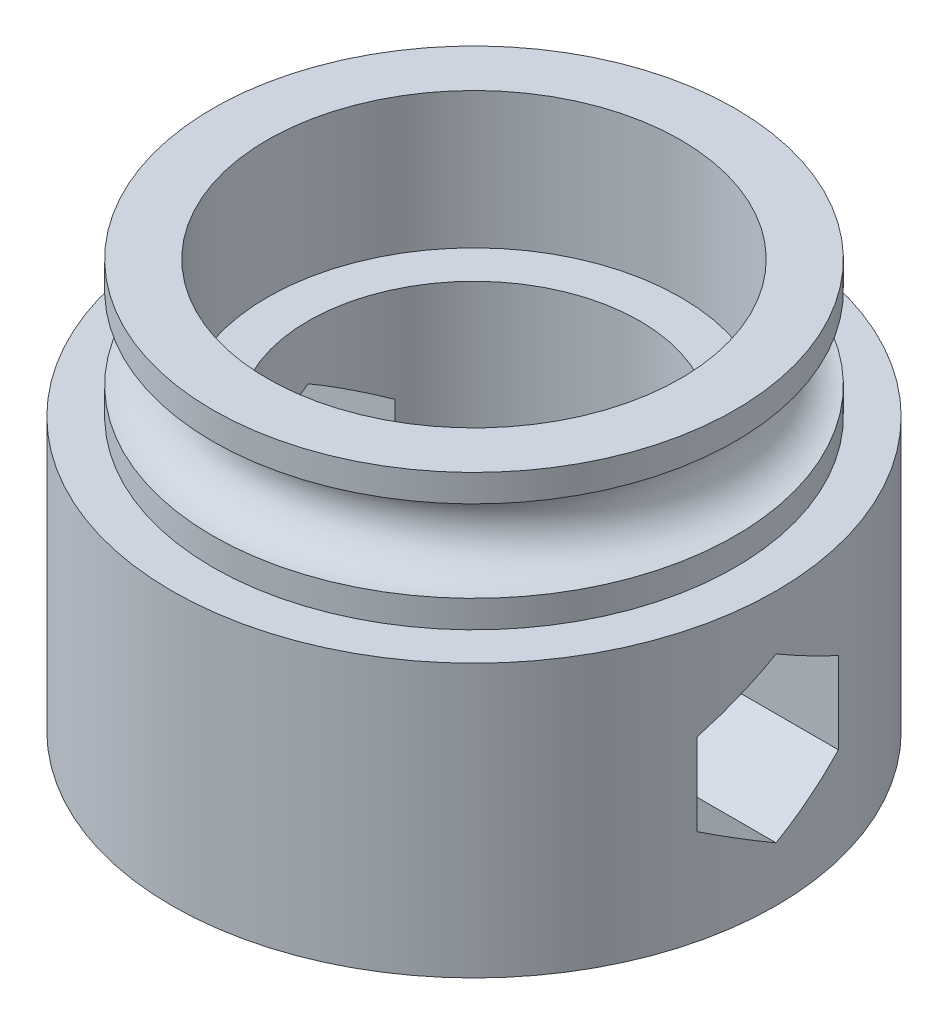
ISO-10303-21;
HEADER;
FILE_DESCRIPTION(('STEP AP214'),'2;1');
FILE_NAME('part.step','',(''),(''),'','','');
FILE_SCHEMA(('AUTOMOTIVE_DESIGN { 1 0 10303 214 1 1 1 1 }'));
ENDSEC;
DATA;
#1=APPLICATION_CONTEXT('core data for automotive mechanical design processes');
#2=APPLICATION_PROTOCOL_DEFINITION('international standard','automotive_design',2000,#1);
#3=PRODUCT_CONTEXT('',#1,'mechanical');
#4=PRODUCT('Part','Part','',(#3));
#5=PRODUCT_RELATED_PRODUCT_CATEGORY('part','',(#4));
#6=PRODUCT_DEFINITION_FORMATION('','',#4);
#7=PRODUCT_DEFINITION_CONTEXT('part definition',#1,'design');
#8=PRODUCT_DEFINITION('design','',#6,#7);
#9=PRODUCT_DEFINITION_SHAPE('','',#8);
#10=(LENGTH_UNIT() NAMED_UNIT(*) SI_UNIT(.MILLI.,.METRE.));
#11=(NAMED_UNIT(*) PLANE_ANGLE_UNIT() SI_UNIT($,.RADIAN.));
#12=(NAMED_UNIT(*) SI_UNIT($,.STERADIAN.) SOLID_ANGLE_UNIT());
#13=UNCERTAINTY_MEASURE_WITH_UNIT(LENGTH_MEASURE(1.E-05),#10,'distance_accuracy_value','');
#14=(GEOMETRIC_REPRESENTATION_CONTEXT(3) GLOBAL_UNCERTAINTY_ASSIGNED_CONTEXT((#13)) GLOBAL_UNIT_ASSIGNED_CONTEXT((#10,
#11,#12)) REPRESENTATION_CONTEXT('',''));
#15=CARTESIAN_POINT('',(0.,0.,0.));
#16=DIRECTION('',(0.,0.,1.));
#17=DIRECTION('',(1.,0.,0.));
#18=AXIS2_PLACEMENT_3D('',#15,#16,#17);
#19=CARTESIAN_POINT('',(-0.608104108648984,1.25,0.));
#20=DIRECTION('',(0.,-1.,0.));
#21=DIRECTION('',(0.,0.,-1.));
#22=AXIS2_PLACEMENT_3D('',#19,#20,#21);
#23=TOROIDAL_SURFACE('',#22,0.958104108648984,0.15);
#24=CARTESIAN_POINT('',(-0.608104108648984,1.1,0.));
#25=DIRECTION('',(0.,-1.,0.));
#26=DIRECTION('',(0.,0.,-1.));
#27=AXIS2_PLACEMENT_3D('',#24,#25,#26);
#28=CIRCLE('',#27,0.958104108648984);
#29=CARTESIAN_POINT('',(-0.608104108648984,1.1,-0.958104108648984));
#30=VERTEX_POINT('',#29);
#31=EDGE_CURVE('E198',#30,#30,#28,.T.);
#32=ORIENTED_EDGE('',*,*,#31,.F.);
#33=EDGE_LOOP('',(#32));
#34=FACE_BOUND('',#33,.T.);
#35=CARTESIAN_POINT('',(-0.608104108648984,1.4,0.));
#36=DIRECTION('',(0.,-1.,0.));
#37=DIRECTION('',(0.,0.,-1.));
#38=AXIS2_PLACEMENT_3D('',#35,#36,#37);
#39=CIRCLE('',#38,0.958104108648984);
#40=CARTESIAN_POINT('',(-0.608104108648984,1.4,-0.958104108648984));
#41=VERTEX_POINT('',#40);
#42=EDGE_CURVE('E171',#41,#41,#39,.T.);
#43=ORIENTED_EDGE('',*,*,#42,.T.);
#44=EDGE_LOOP('',(#43));
#45=FACE_BOUND('',#44,.T.);
#46=ADVANCED_FACE('F37',(#34,#45),#23,.F.);
#47=CARTESIAN_POINT('',(-0.608104108648984,0.,0.));
#48=DIRECTION('',(0.,-1.,0.));
#49=DIRECTION('',(0.,0.,-1.));
#50=AXIS2_PLACEMENT_3D('',#47,#48,#49);
#51=CYLINDRICAL_SURFACE('',#50,0.958104108648984);
#52=ORIENTED_EDGE('',*,*,#42,.F.);
#53=EDGE_LOOP('',(#52));
#54=FACE_BOUND('',#53,.T.);
#55=CARTESIAN_POINT('',(-0.608104108648984,1.5,0.));
#56=DIRECTION('',(0.,-1.,0.));
#57=DIRECTION('',(0.,0.,-1.));
#58=AXIS2_PLACEMENT_3D('',#55,#56,#57);
#59=CIRCLE('',#58,0.958104108648984);
#60=CARTESIAN_POINT('',(-0.608104108648984,1.5,-0.958104108648984));
#61=VERTEX_POINT('',#60);
#62=EDGE_CURVE('E174',#61,#61,#59,.T.);
#63=ORIENTED_EDGE('',*,*,#62,.T.);
#64=EDGE_LOOP('',(#63));
#65=FACE_BOUND('',#64,.T.);
#66=ADVANCED_FACE('F275',(#54,#65),#51,.T.);
#67=CARTESIAN_POINT('',(0.,1.5,0.));
#68=DIRECTION('',(0.,-1.,0.));
#69=DIRECTION('',(0.,0.,-1.));
#70=AXIS2_PLACEMENT_3D('',#67,#68,#69);
#71=PLANE('',#70);
#72=ORIENTED_EDGE('',*,*,#62,.F.);
#73=EDGE_LOOP('',(#72));
#74=FACE_BOUND('',#73,.T.);
#75=CARTESIAN_POINT('',(-0.608104108648984,1.5,0.));
#76=DIRECTION('',(0.,-1.,0.));
#77=DIRECTION('',(0.,0.,-1.));
#78=AXIS2_PLACEMENT_3D('',#75,#76,#77);
#79=CIRCLE('',#78,0.758104108648984);
#80=CARTESIAN_POINT('',(-0.608104108648984,1.5,-0.758104108648984));
#81=VERTEX_POINT('',#80);
#82=EDGE_CURVE('E177',#81,#81,#79,.T.);
#83=ORIENTED_EDGE('',*,*,#82,.T.);
#84=EDGE_LOOP('',(#83));
#85=FACE_BOUND('',#84,.T.);
#86=ADVANCED_FACE('F280',(#74,#85),#71,.F.);
#87=CARTESIAN_POINT('',(-0.608104108648984,0.,0.));
#88=DIRECTION('',(0.,-1.,0.));
#89=DIRECTION('',(0.,0.,-1.));
#90=AXIS2_PLACEMENT_3D('',#87,#88,#89);
#91=CYLINDRICAL_SURFACE('',#90,0.758104108648984);
#92=ORIENTED_EDGE('',*,*,#82,.F.);
#93=EDGE_LOOP('',(#92));
#94=FACE_BOUND('',#93,.T.);
#95=CARTESIAN_POINT('',(-0.608104108648984,1.,0.));
#96=DIRECTION('',(0.,-1.,0.));
#97=DIRECTION('',(0.,0.,-1.));
#98=AXIS2_PLACEMENT_3D('',#95,#96,#97);
#99=CIRCLE('',#98,0.758104108648984);
#100=CARTESIAN_POINT('',(-0.608104108648984,1.,-0.758104108648984));
#101=VERTEX_POINT('',#100);
#102=EDGE_CURVE('E180',#101,#101,#99,.T.);
#103=ORIENTED_EDGE('',*,*,#102,.T.);
#104=EDGE_LOOP('',(#103));
#105=FACE_BOUND('',#104,.T.);
#106=ADVANCED_FACE('F290',(#94,#105),#91,.F.);
#107=CARTESIAN_POINT('',(0.,1.,0.));
#108=DIRECTION('',(0.,-1.,0.));
#109=DIRECTION('',(0.,0.,-1.));
#110=AXIS2_PLACEMENT_3D('',#107,#108,#109);
#111=PLANE('',#110);
#112=ORIENTED_EDGE('',*,*,#102,.F.);
#113=EDGE_LOOP('',(#112));
#114=FACE_BOUND('',#113,.T.);
#115=CARTESIAN_POINT('',(-0.608104108648984,1.,0.));
#116=DIRECTION('',(0.,-1.,0.));
#117=DIRECTION('',(0.,0.,-1.));
#118=AXIS2_PLACEMENT_3D('',#115,#116,#117);
#119=CIRCLE('',#118,0.608104108648984);
#120=CARTESIAN_POINT('',(-0.608104108648984,1.,-0.608104108648984));
#121=VERTEX_POINT('',#120);
#122=EDGE_CURVE('E183',#121,#121,#119,.T.);
#123=ORIENTED_EDGE('',*,*,#122,.T.);
#124=EDGE_LOOP('',(#123));
#125=FACE_BOUND('',#124,.T.);
#126=ADVANCED_FACE('F296',(#114,#125),#111,.F.);
#127=CARTESIAN_POINT('',(-0.608104108648984,0.,0.));
#128=DIRECTION('',(0.,-1.,0.));
#129=DIRECTION('',(0.,0.,-1.));
#130=AXIS2_PLACEMENT_3D('',#127,#128,#129);
#131=CYLINDRICAL_SURFACE('',#130,0.608104108648984);
#132=CARTESIAN_POINT('',(-0.608104108648984,0.8,0.));
#133=DIRECTION('',(0.,0.866025403784438,0.5));
#134=DIRECTION('',(0.,-0.5,0.866025403784439));
#135=AXIS2_PLACEMENT_3D('',#132,#133,#134);
#136=ELLIPSE('',#135,0.702178141647617,0.608104108648984);
#137=CARTESIAN_POINT('',(-1.15791371838291,0.65,0.259807621135331));
#138=VERTEX_POINT('',#137);
#139=CARTESIAN_POINT('',(-1.21620821729797,0.8,0.));
#140=VERTEX_POINT('',#139);
#141=EDGE_CURVE('E223',#138,#140,#136,.F.);
#142=ORIENTED_EDGE('',*,*,#141,.T.);
#143=CARTESIAN_POINT('',(-0.608104108648984,0.8,0.));
#144=DIRECTION('',(0.,0.866025403784439,-0.5));
#145=DIRECTION('',(0.,-0.5,-0.866025403784439));
#146=AXIS2_PLACEMENT_3D('',#143,#144,#145);
#147=ELLIPSE('',#146,0.702178141647616,0.608104108648984);
#148=CARTESIAN_POINT('',(-1.15791371838291,0.65,-0.259807621135331));
#149=VERTEX_POINT('',#148);
#150=EDGE_CURVE('E202',#140,#149,#147,.F.);
#151=ORIENTED_EDGE('',*,*,#150,.T.);
#152=DIRECTION('',(0.,-1.,0.));
#153=VECTOR('',#152,1.);
#154=CARTESIAN_POINT('',(-1.15791371838291,0.,-0.259807621135331));
#155=LINE('',#154,#153);
#156=CARTESIAN_POINT('',(-1.15791371838291,0.35,-0.259807621135331));
#157=VERTEX_POINT('',#156);
#158=EDGE_CURVE('E208',#149,#157,#155,.T.);
#159=ORIENTED_EDGE('',*,*,#158,.T.);
#160=CARTESIAN_POINT('',(-0.608104108648984,0.2,0.));
#161=DIRECTION('',(0.,-0.866025403784438,-0.5));
#162=DIRECTION('',(0.,-0.5,0.866025403784439));
#163=AXIS2_PLACEMENT_3D('',#160,#161,#162);
#164=ELLIPSE('',#163,0.702178141647617,0.608104108648984);
#165=CARTESIAN_POINT('',(-1.21620821729797,0.2,0.));
#166=VERTEX_POINT('',#165);
#167=EDGE_CURVE('E211',#157,#166,#164,.F.);
#168=ORIENTED_EDGE('',*,*,#167,.T.);
#169=CARTESIAN_POINT('',(-0.608104108648984,0.2,0.));
#170=DIRECTION('',(0.,-0.866025403784438,0.5));
#171=DIRECTION('',(0.,-0.5,-0.866025403784439));
#172=AXIS2_PLACEMENT_3D('',#169,#170,#171);
#173=ELLIPSE('',#172,0.702178141647617,0.608104108648984);
#174=CARTESIAN_POINT('',(-1.15791371838291,0.35,0.259807621135331));
#175=VERTEX_POINT('',#174);
#176=EDGE_CURVE('E214',#166,#175,#173,.F.);
#177=ORIENTED_EDGE('',*,*,#176,.T.);
#178=DIRECTION('',(0.,-1.,0.));
#179=VECTOR('',#178,1.);
#180=CARTESIAN_POINT('',(-1.15791371838291,0.,0.259807621135331));
#181=LINE('',#180,#179);
#182=EDGE_CURVE('E217',#175,#138,#181,.F.);
#183=ORIENTED_EDGE('',*,*,#182,.T.);
#184=EDGE_LOOP('',(#142,#151,#159,#168,#177,#183));
#185=FACE_BOUND('',#184,.T.);
#186=DIRECTION('',(0.,-1.,0.));
#187=VECTOR('',#186,1.);
#188=CARTESIAN_POINT('',(-0.058294498915055,0.,-0.259807621135331));
#189=LINE('',#188,#187);
#190=CARTESIAN_POINT('',(-0.0582944989150559,0.35,-0.259807621135331));
#191=VERTEX_POINT('',#190);
#192=CARTESIAN_POINT('',(-0.0582944989150553,0.65,-0.259807621135331));
#193=VERTEX_POINT('',#192);
#194=EDGE_CURVE('E205',#191,#193,#189,.F.);
#195=ORIENTED_EDGE('',*,*,#194,.T.);
#196=CARTESIAN_POINT('',(0.,0.8,0.));
#197=VERTEX_POINT('',#196);
#198=EDGE_CURVE('E201',#193,#197,#147,.F.);
#199=ORIENTED_EDGE('',*,*,#198,.T.);
#200=CARTESIAN_POINT('',(-0.0582944989150557,0.65,0.259807621135331));
#201=VERTEX_POINT('',#200);
#202=EDGE_CURVE('E224',#197,#201,#136,.F.);
#203=ORIENTED_EDGE('',*,*,#202,.T.);
#204=DIRECTION('',(0.,-1.,0.));
#205=VECTOR('',#204,1.);
#206=CARTESIAN_POINT('',(-0.058294498915055,0.,0.259807621135331));
#207=LINE('',#206,#205);
#208=CARTESIAN_POINT('',(-0.0582944989150553,0.35,0.259807621135331));
#209=VERTEX_POINT('',#208);
#210=EDGE_CURVE('E220',#201,#209,#207,.T.);
#211=ORIENTED_EDGE('',*,*,#210,.T.);
#212=CARTESIAN_POINT('',(0.,0.2,0.));
#213=VERTEX_POINT('',#212);
#214=EDGE_CURVE('E215',#209,#213,#173,.F.);
#215=ORIENTED_EDGE('',*,*,#214,.T.);
#216=EDGE_CURVE('E147',#213,#191,#164,.F.);
#217=ORIENTED_EDGE('',*,*,#216,.T.);
#218=EDGE_LOOP('',(#195,#199,#203,#211,#215,#217));
#219=FACE_BOUND('',#218,.T.);
#220=ORIENTED_EDGE('',*,*,#122,.F.);
#221=EDGE_LOOP('',(#220));
#222=FACE_BOUND('',#221,.T.);
#223=CARTESIAN_POINT('',(-0.608104108648984,0.,0.));
#224=DIRECTION('',(0.,-1.,0.));
#225=DIRECTION('',(0.,0.,-1.));
#226=AXIS2_PLACEMENT_3D('',#223,#224,#225);
#227=CIRCLE('',#226,0.608104108648984);
#228=CARTESIAN_POINT('',(-0.608104108648984,0.,-0.608104108648984));
#229=VERTEX_POINT('',#228);
#230=EDGE_CURVE('E186',#229,#229,#227,.T.);
#231=ORIENTED_EDGE('',*,*,#230,.T.);
#232=EDGE_LOOP('',(#231));
#233=FACE_BOUND('',#232,.T.);
#234=ADVANCED_FACE('F251',(#185,#219,#222,#233),#131,.F.);
#235=CARTESIAN_POINT('',(0.,0.,0.));
#236=DIRECTION('',(0.,1.,0.));
#237=DIRECTION('',(0.,0.,1.));
#238=AXIS2_PLACEMENT_3D('',#235,#236,#237);
#239=PLANE('',#238);
#240=ORIENTED_EDGE('',*,*,#230,.F.);
#241=EDGE_LOOP('',(#240));
#242=FACE_BOUND('',#241,.T.);
#243=CARTESIAN_POINT('',(-0.608104108648984,0.,0.));
#244=DIRECTION('',(0.,-1.,0.));
#245=DIRECTION('',(0.,0.,-1.));
#246=AXIS2_PLACEMENT_3D('',#243,#244,#245);
#247=CIRCLE('',#246,1.10810410864898);
#248=CARTESIAN_POINT('',(-0.608104108648984,0.,-1.10810410864898));
#249=VERTEX_POINT('',#248);
#250=EDGE_CURVE('E189',#249,#249,#247,.T.);
#251=ORIENTED_EDGE('',*,*,#250,.T.);
#252=EDGE_LOOP('',(#251));
#253=FACE_BOUND('',#252,.T.);
#254=ADVANCED_FACE('F306',(#242,#253),#239,.F.);
#255=CARTESIAN_POINT('',(-0.608104108648984,0.,0.));
#256=DIRECTION('',(0.,-1.,0.));
#257=DIRECTION('',(0.,0.,-1.));
#258=AXIS2_PLACEMENT_3D('',#255,#256,#257);
#259=CYLINDRICAL_SURFACE('',#258,1.10810410864898);
#260=DIRECTION('',(0.,-1.,0.));
#261=VECTOR('',#260,1.);
#262=CARTESIAN_POINT('',(-1.68532029660977,0.,-0.259807621135331));
#263=LINE('',#262,#261);
#264=CARTESIAN_POINT('',(-1.68532029660977,0.35,-0.259807621135331));
#265=VERTEX_POINT('',#264);
#266=CARTESIAN_POINT('',(-1.68532029660977,0.65,-0.259807621135331));
#267=VERTEX_POINT('',#266);
#268=EDGE_CURVE('E40',#265,#267,#263,.F.);
#269=ORIENTED_EDGE('',*,*,#268,.T.);
#270=CARTESIAN_POINT('',(-0.608104108648984,0.8,0.));
#271=DIRECTION('',(0.,0.866025403784439,-0.5));
#272=DIRECTION('',(0.,-0.5,-0.866025403784439));
#273=AXIS2_PLACEMENT_3D('',#270,#271,#272);
#274=ELLIPSE('',#273,1.27952841083724,1.10810410864898);
#275=CARTESIAN_POINT('',(-1.71620821729797,0.8,0.));
#276=VERTEX_POINT('',#275);
#277=EDGE_CURVE('E11',#267,#276,#274,.T.);
#278=ORIENTED_EDGE('',*,*,#277,.T.);
#279=CARTESIAN_POINT('',(-0.608104108648984,0.8,0.));
#280=DIRECTION('',(0.,0.866025403784438,0.5));
#281=DIRECTION('',(0.,-0.5,0.866025403784439));
#282=AXIS2_PLACEMENT_3D('',#279,#280,#281);
#283=ELLIPSE('',#282,1.27952841083724,1.10810410864898);
#284=CARTESIAN_POINT('',(-1.68532029660977,0.65,0.259807621135331));
#285=VERTEX_POINT('',#284);
#286=EDGE_CURVE('E166',#276,#285,#283,.T.);
#287=ORIENTED_EDGE('',*,*,#286,.T.);
#288=DIRECTION('',(0.,-1.,0.));
#289=VECTOR('',#288,1.);
#290=CARTESIAN_POINT('',(-1.68532029660977,0.,0.259807621135331));
#291=LINE('',#290,#289);
#292=CARTESIAN_POINT('',(-1.68532029660977,0.35,0.259807621135331));
#293=VERTEX_POINT('',#292);
#294=EDGE_CURVE('E164',#285,#293,#291,.T.);
#295=ORIENTED_EDGE('',*,*,#294,.T.);
#296=CARTESIAN_POINT('',(-0.608104108648984,0.2,0.));
#297=DIRECTION('',(0.,-0.866025403784438,0.5));
#298=DIRECTION('',(0.,-0.5,-0.866025403784439));
#299=AXIS2_PLACEMENT_3D('',#296,#297,#298);
#300=ELLIPSE('',#299,1.27952841083724,1.10810410864898);
#301=CARTESIAN_POINT('',(-1.71620821729797,0.2,0.));
#302=VERTEX_POINT('',#301);
#303=EDGE_CURVE('E141',#293,#302,#300,.T.);
#304=ORIENTED_EDGE('',*,*,#303,.T.);
#305=CARTESIAN_POINT('',(-0.608104108648984,0.2,0.));
#306=DIRECTION('',(0.,-0.866025403784438,-0.5));
#307=DIRECTION('',(0.,-0.5,0.866025403784439));
#308=AXIS2_PLACEMENT_3D('',#305,#306,#307);
#309=ELLIPSE('',#308,1.27952841083724,1.10810410864898);
#310=EDGE_CURVE('E158',#302,#265,#309,.T.);
#311=ORIENTED_EDGE('',*,*,#310,.T.);
#312=EDGE_LOOP('',(#269,#278,#287,#295,#304,#311));
#313=FACE_BOUND('',#312,.T.);
#314=CARTESIAN_POINT('',(0.469112079311797,0.65,0.259807621135331));
#315=VERTEX_POINT('',#314);
#316=CARTESIAN_POINT('',(0.5,0.8,0.));
#317=VERTEX_POINT('',#316);
#318=EDGE_CURVE('E169',#315,#317,#283,.T.);
#319=ORIENTED_EDGE('',*,*,#318,.T.);
#320=CARTESIAN_POINT('',(0.469112079311797,0.65,-0.259807621135331));
#321=VERTEX_POINT('',#320);
#322=EDGE_CURVE('E46',#317,#321,#274,.T.);
#323=ORIENTED_EDGE('',*,*,#322,.T.);
#324=DIRECTION('',(0.,-1.,0.));
#325=VECTOR('',#324,1.);
#326=CARTESIAN_POINT('',(0.469112079311798,0.,-0.259807621135331));
#327=LINE('',#326,#325);
#328=CARTESIAN_POINT('',(0.469112079311797,0.35,-0.259807621135331));
#329=VERTEX_POINT('',#328);
#330=EDGE_CURVE('E156',#321,#329,#327,.T.);
#331=ORIENTED_EDGE('',*,*,#330,.T.);
#332=CARTESIAN_POINT('',(0.5,0.2,0.));
#333=VERTEX_POINT('',#332);
#334=EDGE_CURVE('E138',#329,#333,#309,.T.);
#335=ORIENTED_EDGE('',*,*,#334,.T.);
#336=CARTESIAN_POINT('',(0.469112079311797,0.35,0.259807621135331));
#337=VERTEX_POINT('',#336);
#338=EDGE_CURVE('E128',#333,#337,#300,.T.);
#339=ORIENTED_EDGE('',*,*,#338,.T.);
#340=DIRECTION('',(0.,-1.,0.));
#341=VECTOR('',#340,1.);
#342=CARTESIAN_POINT('',(0.469112079311798,0.,0.259807621135331));
#343=LINE('',#342,#341);
#344=EDGE_CURVE('E139',#337,#315,#343,.F.);
#345=ORIENTED_EDGE('',*,*,#344,.T.);
#346=EDGE_LOOP('',(#319,#323,#331,#335,#339,#345));
#347=FACE_BOUND('',#346,.T.);
#348=ORIENTED_EDGE('',*,*,#250,.F.);
#349=EDGE_LOOP('',(#348));
#350=FACE_BOUND('',#349,.T.);
#351=CARTESIAN_POINT('',(-0.608104108648984,1.,0.));
#352=DIRECTION('',(0.,-1.,0.));
#353=DIRECTION('',(0.,0.,-1.));
#354=AXIS2_PLACEMENT_3D('',#351,#352,#353);
#355=CIRCLE('',#354,1.10810410864898);
#356=CARTESIAN_POINT('',(-0.608104108648984,1.,-1.10810410864898));
#357=VERTEX_POINT('',#356);
#358=EDGE_CURVE('E192',#357,#357,#355,.T.);
#359=ORIENTED_EDGE('',*,*,#358,.T.);
#360=EDGE_LOOP('',(#359));
#361=FACE_BOUND('',#360,.T.);
#362=ADVANCED_FACE('F153',(#313,#347,#350,#361),#259,.T.);
#363=CARTESIAN_POINT('',(0.,1.,0.));
#364=DIRECTION('',(0.,-1.,0.));
#365=DIRECTION('',(0.,0.,-1.));
#366=AXIS2_PLACEMENT_3D('',#363,#364,#365);
#367=PLANE('',#366);
#368=ORIENTED_EDGE('',*,*,#358,.F.);
#369=EDGE_LOOP('',(#368));
#370=FACE_BOUND('',#369,.T.);
#371=CARTESIAN_POINT('',(-0.608104108648984,1.,0.));
#372=DIRECTION('',(0.,-1.,0.));
#373=DIRECTION('',(0.,0.,-1.));
#374=AXIS2_PLACEMENT_3D('',#371,#372,#373);
#375=CIRCLE('',#374,0.958104108648984);
#376=CARTESIAN_POINT('',(-0.608104108648984,1.,-0.958104108648984));
#377=VERTEX_POINT('',#376);
#378=EDGE_CURVE('E195',#377,#377,#375,.T.);
#379=ORIENTED_EDGE('',*,*,#378,.T.);
#380=EDGE_LOOP('',(#379));
#381=FACE_BOUND('',#380,.T.);
#382=ADVANCED_FACE('F316',(#370,#381),#367,.F.);
#383=CARTESIAN_POINT('',(-0.608104108648984,0.,0.));
#384=DIRECTION('',(0.,-1.,0.));
#385=DIRECTION('',(0.,0.,-1.));
#386=AXIS2_PLACEMENT_3D('',#383,#384,#385);
#387=CYLINDRICAL_SURFACE('',#386,0.958104108648984);
#388=ORIENTED_EDGE('',*,*,#378,.F.);
#389=EDGE_LOOP('',(#388));
#390=FACE_BOUND('',#389,.T.);
#391=ORIENTED_EDGE('',*,*,#31,.T.);
#392=EDGE_LOOP('',(#391));
#393=FACE_BOUND('',#392,.T.);
#394=ADVANCED_FACE('F322',(#390,#393),#387,.T.);
#395=CARTESIAN_POINT('',(-1.71620821729797,0.8,0.));
#396=DIRECTION('',(0.,0.866025403784438,0.5));
#397=DIRECTION('',(0.,-0.5,0.866025403784439));
#398=AXIS2_PLACEMENT_3D('',#395,#396,#397);
#399=PLANE('',#398);
#400=DIRECTION('',(1.,0.,0.));
#401=VECTOR('',#400,1.);
#402=CARTESIAN_POINT('',(-1.71620821729797,0.65,0.259807621135331));
#403=LINE('',#402,#401);
#404=EDGE_CURVE('E231',#285,#138,#403,.T.);
#405=ORIENTED_EDGE('',*,*,#404,.F.);
#406=ORIENTED_EDGE('',*,*,#286,.F.);
#407=DIRECTION('',(1.,0.,0.));
#408=VECTOR('',#407,1.);
#409=CARTESIAN_POINT('',(-1.71620821729797,0.8,0.));
#410=LINE('',#409,#408);
#411=EDGE_CURVE('E53',#276,#140,#410,.T.);
#412=ORIENTED_EDGE('',*,*,#411,.T.);
#413=ORIENTED_EDGE('',*,*,#141,.F.);
#414=EDGE_LOOP('',(#405,#406,#412,#413));
#415=FACE_BOUND('',#414,.T.);
#416=ADVANCED_FACE('F328',(#415),#399,.F.);
#417=CARTESIAN_POINT('',(-1.71620821729797,0.65,0.259807621135331));
#418=DIRECTION('',(0.,0.,1.));
#419=DIRECTION('',(0.,-1.,0.));
#420=AXIS2_PLACEMENT_3D('',#417,#418,#419);
#421=PLANE('',#420);
#422=DIRECTION('',(1.,0.,0.));
#423=VECTOR('',#422,1.);
#424=CARTESIAN_POINT('',(-1.71620821729797,0.35,0.259807621135331));
#425=LINE('',#424,#423);
#426=EDGE_CURVE('E149',#293,#175,#425,.T.);
#427=ORIENTED_EDGE('',*,*,#426,.F.);
#428=ORIENTED_EDGE('',*,*,#294,.F.);
#429=ORIENTED_EDGE('',*,*,#404,.T.);
#430=ORIENTED_EDGE('',*,*,#182,.F.);
#431=EDGE_LOOP('',(#427,#428,#429,#430));
#432=FACE_BOUND('',#431,.T.);
#433=ADVANCED_FACE('F333',(#432),#421,.F.);
#434=CARTESIAN_POINT('',(-1.71620821729797,0.35,0.259807621135331));
#435=DIRECTION('',(0.,-0.866025403784438,0.5));
#436=DIRECTION('',(0.,-0.5,-0.866025403784439));
#437=AXIS2_PLACEMENT_3D('',#434,#435,#436);
#438=PLANE('',#437);
#439=DIRECTION('',(1.,0.,0.));
#440=VECTOR('',#439,1.);
#441=CARTESIAN_POINT('',(-1.71620821729797,0.2,0.));
#442=LINE('',#441,#440);
#443=EDGE_CURVE('E148',#302,#166,#442,.T.);
#444=ORIENTED_EDGE('',*,*,#443,.F.);
#445=ORIENTED_EDGE('',*,*,#303,.F.);
#446=ORIENTED_EDGE('',*,*,#426,.T.);
#447=ORIENTED_EDGE('',*,*,#176,.F.);
#448=EDGE_LOOP('',(#444,#445,#446,#447));
#449=FACE_BOUND('',#448,.T.);
#450=ADVANCED_FACE('F339',(#449),#438,.F.);
#451=CARTESIAN_POINT('',(-1.71620821729797,0.2,0.));
#452=DIRECTION('',(0.,-0.866025403784438,-0.5));
#453=DIRECTION('',(0.,0.5,-0.866025403784439));
#454=AXIS2_PLACEMENT_3D('',#451,#452,#453);
#455=PLANE('',#454);
#456=DIRECTION('',(1.,0.,0.));
#457=VECTOR('',#456,1.);
#458=CARTESIAN_POINT('',(-1.71620821729797,0.35,-0.259807621135331));
#459=LINE('',#458,#457);
#460=EDGE_CURVE('E236',#265,#157,#459,.T.);
#461=ORIENTED_EDGE('',*,*,#460,.F.);
#462=ORIENTED_EDGE('',*,*,#310,.F.);
#463=ORIENTED_EDGE('',*,*,#443,.T.);
#464=ORIENTED_EDGE('',*,*,#167,.F.);
#465=EDGE_LOOP('',(#461,#462,#463,#464));
#466=FACE_BOUND('',#465,.T.);
#467=ADVANCED_FACE('F271',(#466),#455,.F.);
#468=CARTESIAN_POINT('',(-1.71620821729797,0.35,-0.259807621135331));
#469=DIRECTION('',(0.,0.,-1.));
#470=DIRECTION('',(-1.,0.,0.));
#471=AXIS2_PLACEMENT_3D('',#468,#469,#470);
#472=PLANE('',#471);
#473=DIRECTION('',(1.,0.,0.));
#474=VECTOR('',#473,1.);
#475=CARTESIAN_POINT('',(-1.71620821729797,0.65,-0.259807621135331));
#476=LINE('',#475,#474);
#477=EDGE_CURVE('E227',#267,#149,#476,.T.);
#478=ORIENTED_EDGE('',*,*,#477,.F.);
#479=ORIENTED_EDGE('',*,*,#268,.F.);
#480=ORIENTED_EDGE('',*,*,#460,.T.);
#481=ORIENTED_EDGE('',*,*,#158,.F.);
#482=EDGE_LOOP('',(#478,#479,#480,#481));
#483=FACE_BOUND('',#482,.T.);
#484=ADVANCED_FACE('F247',(#483),#472,.F.);
#485=CARTESIAN_POINT('',(-1.71620821729797,0.65,-0.259807621135331));
#486=DIRECTION('',(0.,0.866025403784439,-0.5));
#487=DIRECTION('',(0.,0.5,0.866025403784439));
#488=AXIS2_PLACEMENT_3D('',#485,#486,#487);
#489=PLANE('',#488);
#490=ORIENTED_EDGE('',*,*,#411,.F.);
#491=ORIENTED_EDGE('',*,*,#277,.F.);
#492=ORIENTED_EDGE('',*,*,#477,.T.);
#493=ORIENTED_EDGE('',*,*,#150,.F.);
#494=EDGE_LOOP('',(#490,#491,#492,#493));
#495=FACE_BOUND('',#494,.T.);
#496=ADVANCED_FACE('F255',(#495),#489,.F.);
#497=EDGE_CURVE('E237',#193,#321,#476,.T.);
#498=ORIENTED_EDGE('',*,*,#497,.T.);
#499=ORIENTED_EDGE('',*,*,#322,.F.);
#500=EDGE_CURVE('E229',#197,#317,#410,.T.);
#501=ORIENTED_EDGE('',*,*,#500,.F.);
#502=ORIENTED_EDGE('',*,*,#198,.F.);
#503=EDGE_LOOP('',(#498,#499,#501,#502));
#504=FACE_BOUND('',#503,.T.);
#505=ADVANCED_FACE('F259',(#504),#489,.F.);
#506=EDGE_CURVE('E234',#191,#329,#459,.T.);
#507=ORIENTED_EDGE('',*,*,#506,.T.);
#508=ORIENTED_EDGE('',*,*,#330,.F.);
#509=ORIENTED_EDGE('',*,*,#497,.F.);
#510=ORIENTED_EDGE('',*,*,#194,.F.);
#511=EDGE_LOOP('',(#507,#508,#509,#510));
#512=FACE_BOUND('',#511,.T.);
#513=ADVANCED_FACE('F263',(#512),#472,.F.);
#514=EDGE_CURVE('E131',#213,#333,#442,.T.);
#515=ORIENTED_EDGE('',*,*,#514,.T.);
#516=ORIENTED_EDGE('',*,*,#334,.F.);
#517=ORIENTED_EDGE('',*,*,#506,.F.);
#518=ORIENTED_EDGE('',*,*,#216,.F.);
#519=EDGE_LOOP('',(#515,#516,#517,#518));
#520=FACE_BOUND('',#519,.T.);
#521=ADVANCED_FACE('F143',(#520),#455,.F.);
#522=EDGE_CURVE('E134',#209,#337,#425,.T.);
#523=ORIENTED_EDGE('',*,*,#522,.T.);
#524=ORIENTED_EDGE('',*,*,#338,.F.);
#525=ORIENTED_EDGE('',*,*,#514,.F.);
#526=ORIENTED_EDGE('',*,*,#214,.F.);
#527=EDGE_LOOP('',(#523,#524,#525,#526));
#528=FACE_BOUND('',#527,.T.);
#529=ADVANCED_FACE('F130',(#528),#438,.F.);
#530=EDGE_CURVE('E61',#201,#315,#403,.T.);
#531=ORIENTED_EDGE('',*,*,#530,.T.);
#532=ORIENTED_EDGE('',*,*,#344,.F.);
#533=ORIENTED_EDGE('',*,*,#522,.F.);
#534=ORIENTED_EDGE('',*,*,#210,.F.);
#535=EDGE_LOOP('',(#531,#532,#533,#534));
#536=FACE_BOUND('',#535,.T.);
#537=ADVANCED_FACE('F341',(#536),#421,.F.);
#538=ORIENTED_EDGE('',*,*,#500,.T.);
#539=ORIENTED_EDGE('',*,*,#318,.F.);
#540=ORIENTED_EDGE('',*,*,#530,.F.);
#541=ORIENTED_EDGE('',*,*,#202,.F.);
#542=EDGE_LOOP('',(#538,#539,#540,#541));
#543=FACE_BOUND('',#542,.T.);
#544=ADVANCED_FACE('F335',(#543),#399,.F.);
#545=CLOSED_SHELL('',(#46,#66,#86,#106,#126,#234,#254,#362,#382,#394,#416,#433,#450,#467,#484,
#496,#505,#513,#521,#529,#537,#544));
#546=MANIFOLD_SOLID_BREP('B2',#545);
#547=ADVANCED_BREP_SHAPE_REPRESENTATION('',(#18,#546),#14);
#548=SHAPE_DEFINITION_REPRESENTATION(#9,#547);
ENDSEC;
END-ISO-10303-21;
